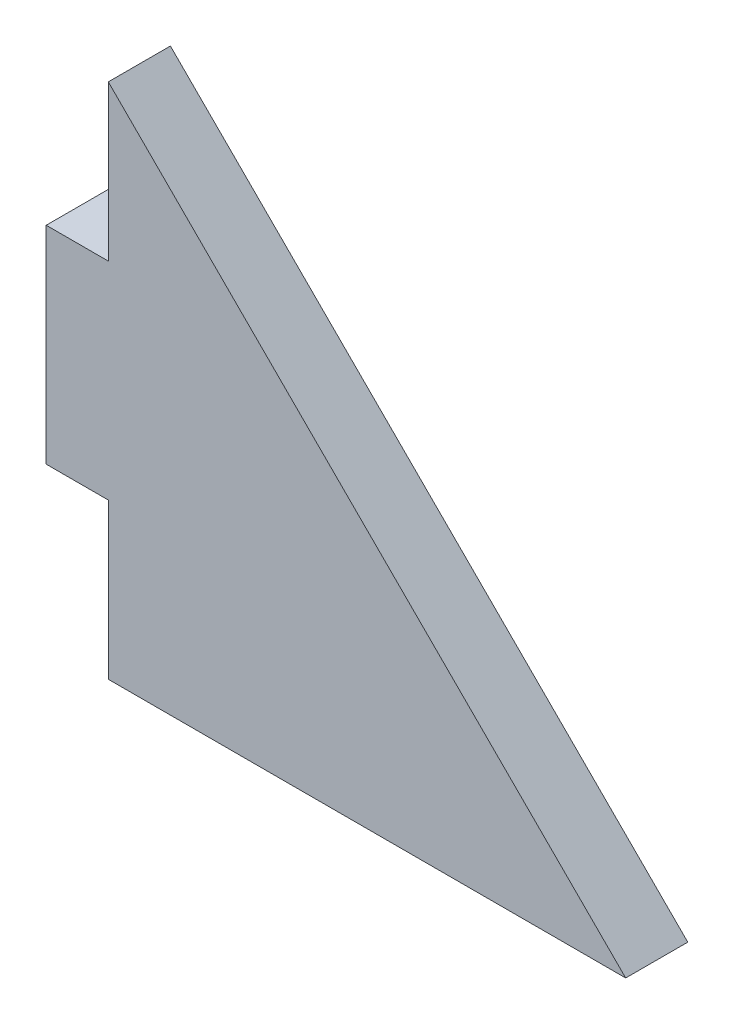
ISO-10303-21;
HEADER;
FILE_DESCRIPTION(('STEP AP214'),'2;1');
FILE_NAME('part.step','',(''),(''),'','','');
FILE_SCHEMA(('AUTOMOTIVE_DESIGN { 1 0 10303 214 1 1 1 1 }'));
ENDSEC;
DATA;
#1=APPLICATION_CONTEXT('core data for automotive mechanical design processes');
#2=APPLICATION_PROTOCOL_DEFINITION('international standard','automotive_design',2000,#1);
#3=PRODUCT_CONTEXT('',#1,'mechanical');
#4=PRODUCT('Part','Part','',(#3));
#5=PRODUCT_RELATED_PRODUCT_CATEGORY('part','',(#4));
#6=PRODUCT_DEFINITION_FORMATION('','',#4);
#7=PRODUCT_DEFINITION_CONTEXT('part definition',#1,'design');
#8=PRODUCT_DEFINITION('design','',#6,#7);
#9=PRODUCT_DEFINITION_SHAPE('','',#8);
#10=(LENGTH_UNIT() NAMED_UNIT(*) SI_UNIT(.MILLI.,.METRE.));
#11=(NAMED_UNIT(*) PLANE_ANGLE_UNIT() SI_UNIT($,.RADIAN.));
#12=(NAMED_UNIT(*) SI_UNIT($,.STERADIAN.) SOLID_ANGLE_UNIT());
#13=UNCERTAINTY_MEASURE_WITH_UNIT(LENGTH_MEASURE(1.E-05),#10,'distance_accuracy_value','');
#14=(GEOMETRIC_REPRESENTATION_CONTEXT(3) GLOBAL_UNCERTAINTY_ASSIGNED_CONTEXT((#13)) GLOBAL_UNIT_ASSIGNED_CONTEXT((#10,
#11,#12)) REPRESENTATION_CONTEXT('',''));
#15=CARTESIAN_POINT('',(0.,0.,0.));
#16=DIRECTION('',(0.,0.,1.));
#17=DIRECTION('',(1.,0.,0.));
#18=AXIS2_PLACEMENT_3D('',#15,#16,#17);
#19=CARTESIAN_POINT('',(25.,0.,3.));
#20=DIRECTION('',(0.,1.,0.));
#21=DIRECTION('',(-1.,0.,0.));
#22=AXIS2_PLACEMENT_3D('',#19,#20,#21);
#23=PLANE('',#22);
#24=DIRECTION('',(1.,0.,0.));
#25=VECTOR('',#24,1.);
#26=CARTESIAN_POINT('',(25.,0.,0.));
#27=LINE('',#26,#25);
#28=CARTESIAN_POINT('',(0.,0.,0.));
#29=VERTEX_POINT('',#28);
#30=CARTESIAN_POINT('',(25.,0.,0.));
#31=VERTEX_POINT('',#30);
#32=EDGE_CURVE('E129',#29,#31,#27,.T.);
#33=ORIENTED_EDGE('',*,*,#32,.T.);
#34=DIRECTION('',(0.,0.,-1.));
#35=VECTOR('',#34,1.);
#36=CARTESIAN_POINT('',(25.,0.,3.));
#37=LINE('',#36,#35);
#38=CARTESIAN_POINT('',(25.,0.,3.));
#39=VERTEX_POINT('',#38);
#40=EDGE_CURVE('E11',#39,#31,#37,.T.);
#41=ORIENTED_EDGE('',*,*,#40,.F.);
#42=DIRECTION('',(1.,0.,0.));
#43=VECTOR('',#42,1.);
#44=CARTESIAN_POINT('',(25.,0.,3.));
#45=LINE('',#44,#43);
#46=CARTESIAN_POINT('',(0.,0.,3.));
#47=VERTEX_POINT('',#46);
#48=EDGE_CURVE('E141',#47,#39,#45,.T.);
#49=ORIENTED_EDGE('',*,*,#48,.F.);
#50=DIRECTION('',(0.,0.,-1.));
#51=VECTOR('',#50,1.);
#52=CARTESIAN_POINT('',(0.,0.,3.));
#53=LINE('',#52,#51);
#54=EDGE_CURVE('E125',#47,#29,#53,.T.);
#55=ORIENTED_EDGE('',*,*,#54,.T.);
#56=EDGE_LOOP('',(#33,#41,#49,#55));
#57=FACE_BOUND('',#56,.T.);
#58=ADVANCED_FACE('F39',(#57),#23,.F.);
#59=CARTESIAN_POINT('',(0.,25.,3.));
#60=DIRECTION('',(-0.707106781186548,-0.707106781186548,0.));
#61=DIRECTION('',(0.707106781186548,-0.707106781186548,0.));
#62=AXIS2_PLACEMENT_3D('',#59,#60,#61);
#63=PLANE('',#62);
#64=DIRECTION('',(-0.707106781186547,0.707106781186547,0.));
#65=VECTOR('',#64,1.);
#66=CARTESIAN_POINT('',(0.,25.,0.));
#67=LINE('',#66,#65);
#68=CARTESIAN_POINT('',(0.,25.,0.));
#69=VERTEX_POINT('',#68);
#70=EDGE_CURVE('E132',#31,#69,#67,.T.);
#71=ORIENTED_EDGE('',*,*,#70,.T.);
#72=DIRECTION('',(0.,0.,-1.));
#73=VECTOR('',#72,1.);
#74=CARTESIAN_POINT('',(0.,25.,3.));
#75=LINE('',#74,#73);
#76=CARTESIAN_POINT('',(0.,25.,3.));
#77=VERTEX_POINT('',#76);
#78=EDGE_CURVE('E47',#77,#69,#75,.T.);
#79=ORIENTED_EDGE('',*,*,#78,.F.);
#80=DIRECTION('',(-0.707106781186547,0.707106781186547,0.));
#81=VECTOR('',#80,1.);
#82=CARTESIAN_POINT('',(0.,25.,3.));
#83=LINE('',#82,#81);
#84=EDGE_CURVE('E95',#39,#77,#83,.T.);
#85=ORIENTED_EDGE('',*,*,#84,.F.);
#86=ORIENTED_EDGE('',*,*,#40,.T.);
#87=EDGE_LOOP('',(#71,#79,#85,#86));
#88=FACE_BOUND('',#87,.T.);
#89=ADVANCED_FACE('F166',(#88),#63,.F.);
#90=CARTESIAN_POINT('',(0.,17.5,3.));
#91=DIRECTION('',(1.,0.,0.));
#92=DIRECTION('',(0.,0.,-1.));
#93=AXIS2_PLACEMENT_3D('',#90,#91,#92);
#94=PLANE('',#93);
#95=DIRECTION('',(0.,-1.,0.));
#96=VECTOR('',#95,1.);
#97=CARTESIAN_POINT('',(0.,17.5,0.));
#98=LINE('',#97,#96);
#99=CARTESIAN_POINT('',(0.,17.5,0.));
#100=VERTEX_POINT('',#99);
#101=EDGE_CURVE('E134',#69,#100,#98,.T.);
#102=ORIENTED_EDGE('',*,*,#101,.T.);
#103=DIRECTION('',(0.,0.,-1.));
#104=VECTOR('',#103,1.);
#105=CARTESIAN_POINT('',(0.,17.5,3.));
#106=LINE('',#105,#104);
#107=CARTESIAN_POINT('',(0.,17.5,3.));
#108=VERTEX_POINT('',#107);
#109=EDGE_CURVE('E145',#108,#100,#106,.T.);
#110=ORIENTED_EDGE('',*,*,#109,.F.);
#111=DIRECTION('',(0.,-1.,0.));
#112=VECTOR('',#111,1.);
#113=CARTESIAN_POINT('',(0.,17.5,3.));
#114=LINE('',#113,#112);
#115=EDGE_CURVE('E153',#77,#108,#114,.T.);
#116=ORIENTED_EDGE('',*,*,#115,.F.);
#117=ORIENTED_EDGE('',*,*,#78,.T.);
#118=EDGE_LOOP('',(#102,#110,#116,#117));
#119=FACE_BOUND('',#118,.T.);
#120=ADVANCED_FACE('F151',(#119),#94,.F.);
#121=CARTESIAN_POINT('',(0.,17.5,3.));
#122=DIRECTION('',(0.,-1.,0.));
#123=DIRECTION('',(0.,0.,-1.));
#124=AXIS2_PLACEMENT_3D('',#121,#122,#123);
#125=PLANE('',#124);
#126=DIRECTION('',(-1.,0.,0.));
#127=VECTOR('',#126,1.);
#128=CARTESIAN_POINT('',(0.,17.5,0.));
#129=LINE('',#128,#127);
#130=CARTESIAN_POINT('',(-3.,17.5,0.));
#131=VERTEX_POINT('',#130);
#132=EDGE_CURVE('E136',#100,#131,#129,.T.);
#133=ORIENTED_EDGE('',*,*,#132,.T.);
#134=DIRECTION('',(0.,0.,-1.));
#135=VECTOR('',#134,1.);
#136=CARTESIAN_POINT('',(-3.,17.5,3.));
#137=LINE('',#136,#135);
#138=CARTESIAN_POINT('',(-3.,17.5,3.));
#139=VERTEX_POINT('',#138);
#140=EDGE_CURVE('E120',#139,#131,#137,.T.);
#141=ORIENTED_EDGE('',*,*,#140,.F.);
#142=DIRECTION('',(-1.,0.,0.));
#143=VECTOR('',#142,1.);
#144=CARTESIAN_POINT('',(0.,17.5,3.));
#145=LINE('',#144,#143);
#146=EDGE_CURVE('E111',#108,#139,#145,.T.);
#147=ORIENTED_EDGE('',*,*,#146,.F.);
#148=ORIENTED_EDGE('',*,*,#109,.T.);
#149=EDGE_LOOP('',(#133,#141,#147,#148));
#150=FACE_BOUND('',#149,.T.);
#151=ADVANCED_FACE('F159',(#150),#125,.F.);
#152=CARTESIAN_POINT('',(-3.,17.5,3.));
#153=DIRECTION('',(1.,0.,0.));
#154=DIRECTION('',(0.,1.,0.));
#155=AXIS2_PLACEMENT_3D('',#152,#153,#154);
#156=PLANE('',#155);
#157=DIRECTION('',(0.,-1.,0.));
#158=VECTOR('',#157,1.);
#159=CARTESIAN_POINT('',(-3.,17.5,0.));
#160=LINE('',#159,#158);
#161=CARTESIAN_POINT('',(-3.,7.5,0.));
#162=VERTEX_POINT('',#161);
#163=EDGE_CURVE('E119',#131,#162,#160,.T.);
#164=ORIENTED_EDGE('',*,*,#163,.T.);
#165=DIRECTION('',(0.,0.,-1.));
#166=VECTOR('',#165,1.);
#167=CARTESIAN_POINT('',(-3.,7.5,3.));
#168=LINE('',#167,#166);
#169=CARTESIAN_POINT('',(-3.,7.5,3.));
#170=VERTEX_POINT('',#169);
#171=EDGE_CURVE('E116',#170,#162,#168,.T.);
#172=ORIENTED_EDGE('',*,*,#171,.F.);
#173=DIRECTION('',(0.,-1.,0.));
#174=VECTOR('',#173,1.);
#175=CARTESIAN_POINT('',(-3.,17.5,3.));
#176=LINE('',#175,#174);
#177=EDGE_CURVE('E105',#139,#170,#176,.T.);
#178=ORIENTED_EDGE('',*,*,#177,.F.);
#179=ORIENTED_EDGE('',*,*,#140,.T.);
#180=EDGE_LOOP('',(#164,#172,#178,#179));
#181=FACE_BOUND('',#180,.T.);
#182=ADVANCED_FACE('F117',(#181),#156,.F.);
#183=CARTESIAN_POINT('',(0.,7.5,3.));
#184=DIRECTION('',(0.,1.,0.));
#185=DIRECTION('',(0.,0.,1.));
#186=AXIS2_PLACEMENT_3D('',#183,#184,#185);
#187=PLANE('',#186);
#188=DIRECTION('',(1.,0.,0.));
#189=VECTOR('',#188,1.);
#190=CARTESIAN_POINT('',(0.,7.5,0.));
#191=LINE('',#190,#189);
#192=CARTESIAN_POINT('',(0.,7.5,0.));
#193=VERTEX_POINT('',#192);
#194=EDGE_CURVE('E81',#162,#193,#191,.T.);
#195=ORIENTED_EDGE('',*,*,#194,.T.);
#196=DIRECTION('',(0.,0.,-1.));
#197=VECTOR('',#196,1.);
#198=CARTESIAN_POINT('',(0.,7.5,3.));
#199=LINE('',#198,#197);
#200=CARTESIAN_POINT('',(0.,7.5,3.));
#201=VERTEX_POINT('',#200);
#202=EDGE_CURVE('E121',#201,#193,#199,.T.);
#203=ORIENTED_EDGE('',*,*,#202,.F.);
#204=DIRECTION('',(1.,0.,0.));
#205=VECTOR('',#204,1.);
#206=CARTESIAN_POINT('',(0.,7.5,3.));
#207=LINE('',#206,#205);
#208=EDGE_CURVE('E109',#170,#201,#207,.T.);
#209=ORIENTED_EDGE('',*,*,#208,.F.);
#210=ORIENTED_EDGE('',*,*,#171,.T.);
#211=EDGE_LOOP('',(#195,#203,#209,#210));
#212=FACE_BOUND('',#211,.T.);
#213=ADVANCED_FACE('F123',(#212),#187,.F.);
#214=CARTESIAN_POINT('',(0.,0.,3.));
#215=DIRECTION('',(1.,0.,0.));
#216=DIRECTION('',(0.,0.,-1.));
#217=AXIS2_PLACEMENT_3D('',#214,#215,#216);
#218=PLANE('',#217);
#219=DIRECTION('',(0.,-1.,0.));
#220=VECTOR('',#219,1.);
#221=CARTESIAN_POINT('',(0.,0.,0.));
#222=LINE('',#221,#220);
#223=EDGE_CURVE('E87',#193,#29,#222,.T.);
#224=ORIENTED_EDGE('',*,*,#223,.T.);
#225=ORIENTED_EDGE('',*,*,#54,.F.);
#226=DIRECTION('',(0.,-1.,0.));
#227=VECTOR('',#226,1.);
#228=CARTESIAN_POINT('',(0.,0.,3.));
#229=LINE('',#228,#227);
#230=EDGE_CURVE('E55',#201,#47,#229,.T.);
#231=ORIENTED_EDGE('',*,*,#230,.F.);
#232=ORIENTED_EDGE('',*,*,#202,.T.);
#233=EDGE_LOOP('',(#224,#225,#231,#232));
#234=FACE_BOUND('',#233,.T.);
#235=ADVANCED_FACE('F180',(#234),#218,.F.);
#236=CARTESIAN_POINT('',(0.,0.,3.));
#237=DIRECTION('',(0.,0.,-1.));
#238=DIRECTION('',(-1.,0.,0.));
#239=AXIS2_PLACEMENT_3D('',#236,#237,#238);
#240=PLANE('',#239);
#241=ORIENTED_EDGE('',*,*,#48,.T.);
#242=ORIENTED_EDGE('',*,*,#84,.T.);
#243=ORIENTED_EDGE('',*,*,#115,.T.);
#244=ORIENTED_EDGE('',*,*,#146,.T.);
#245=ORIENTED_EDGE('',*,*,#177,.T.);
#246=ORIENTED_EDGE('',*,*,#208,.T.);
#247=ORIENTED_EDGE('',*,*,#230,.T.);
#248=EDGE_LOOP('',(#241,#242,#243,#244,#245,#246,#247));
#249=FACE_BOUND('',#248,.T.);
#250=ADVANCED_FACE('F107',(#249),#240,.F.);
#251=CARTESIAN_POINT('',(0.,0.,0.));
#252=DIRECTION('',(0.,0.,-1.));
#253=DIRECTION('',(-1.,0.,0.));
#254=AXIS2_PLACEMENT_3D('',#251,#252,#253);
#255=PLANE('',#254);
#256=ORIENTED_EDGE('',*,*,#32,.F.);
#257=ORIENTED_EDGE('',*,*,#223,.F.);
#258=ORIENTED_EDGE('',*,*,#194,.F.);
#259=ORIENTED_EDGE('',*,*,#163,.F.);
#260=ORIENTED_EDGE('',*,*,#132,.F.);
#261=ORIENTED_EDGE('',*,*,#101,.F.);
#262=ORIENTED_EDGE('',*,*,#70,.F.);
#263=EDGE_LOOP('',(#256,#257,#258,#259,#260,#261,#262));
#264=FACE_BOUND('',#263,.T.);
#265=ADVANCED_FACE('F157',(#264),#255,.T.);
#266=CLOSED_SHELL('',(#58,#89,#120,#151,#182,#213,#235,#250,#265));
#267=MANIFOLD_SOLID_BREP('B2',#266);
#268=ADVANCED_BREP_SHAPE_REPRESENTATION('',(#18,#267),#14);
#269=SHAPE_DEFINITION_REPRESENTATION(#9,#268);
ENDSEC;
END-ISO-10303-21;
